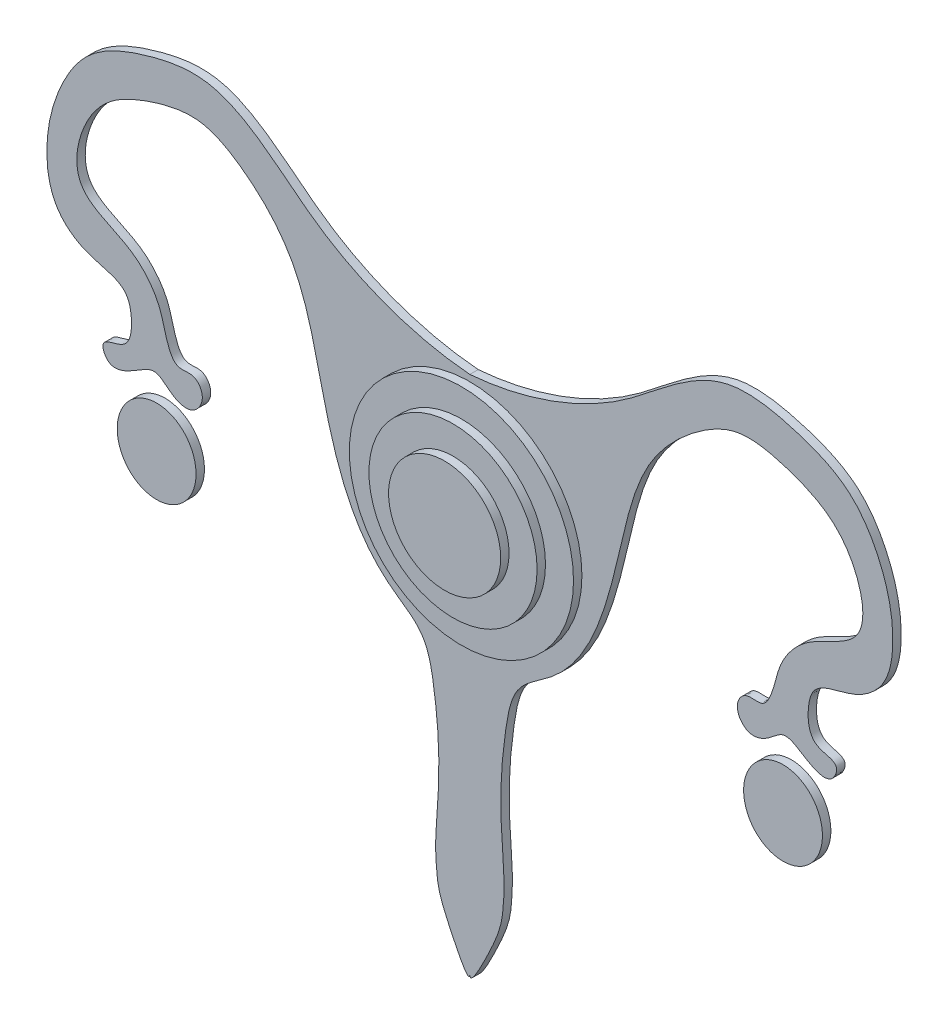
ISO-10303-21;
HEADER;
FILE_DESCRIPTION(('STEP AP214'),'2;1');
FILE_NAME('part.step','',(''),(''),'','','');
FILE_SCHEMA(('AUTOMOTIVE_DESIGN { 1 0 10303 214 1 1 1 1 }'));
ENDSEC;
DATA;
#1=APPLICATION_CONTEXT('core data for automotive mechanical design processes');
#2=APPLICATION_PROTOCOL_DEFINITION('international standard','automotive_design',2000,#1);
#3=PRODUCT_CONTEXT('',#1,'mechanical');
#4=PRODUCT('Part','Part','',(#3));
#5=PRODUCT_RELATED_PRODUCT_CATEGORY('part','',(#4));
#6=PRODUCT_DEFINITION_FORMATION('','',#4);
#7=PRODUCT_DEFINITION_CONTEXT('part definition',#1,'design');
#8=PRODUCT_DEFINITION('design','',#6,#7);
#9=PRODUCT_DEFINITION_SHAPE('','',#8);
#10=(LENGTH_UNIT() NAMED_UNIT(*) SI_UNIT(.MILLI.,.METRE.));
#11=(NAMED_UNIT(*) PLANE_ANGLE_UNIT() SI_UNIT($,.RADIAN.));
#12=(NAMED_UNIT(*) SI_UNIT($,.STERADIAN.) SOLID_ANGLE_UNIT());
#13=UNCERTAINTY_MEASURE_WITH_UNIT(LENGTH_MEASURE(1.E-05),#10,'distance_accuracy_value','');
#14=(GEOMETRIC_REPRESENTATION_CONTEXT(3) GLOBAL_UNCERTAINTY_ASSIGNED_CONTEXT((#13)) GLOBAL_UNIT_ASSIGNED_CONTEXT((#10,
#11,#12)) REPRESENTATION_CONTEXT('',''));
#15=CARTESIAN_POINT('',(0.,0.,0.));
#16=DIRECTION('',(0.,0.,1.));
#17=DIRECTION('',(1.,0.,0.));
#18=AXIS2_PLACEMENT_3D('',#15,#16,#17);
#19=CARTESIAN_POINT('',(-111.75047755853,14.551626748343,-3.));
#20=DIRECTION('',(0.,0.,1.));
#21=DIRECTION('',(0.,1.,0.));
#22=AXIS2_PLACEMENT_3D('',#19,#20,#21);
#23=ELLIPSE('',#22,14.937867758178,14.0602761459405);
#24=DIRECTION('',(0.,0.,1.));
#25=VECTOR('',#24,1.);
#26=SURFACE_OF_LINEAR_EXTRUSION('',#23,#25);
#27=CARTESIAN_POINT('',(-111.75047755853,29.489494506521,-3.));
#28=VERTEX_POINT('',#27);
#29=EDGE_CURVE('E11',#28,#28,#23,.T.);
#30=ORIENTED_EDGE('',*,*,#29,.T.);
#31=EDGE_LOOP('',(#30));
#32=FACE_BOUND('',#31,.T.);
#33=CARTESIAN_POINT('',(-111.75047755853,14.551626748343,0.));
#34=DIRECTION('',(0.,0.,1.));
#35=DIRECTION('',(0.,1.,0.));
#36=AXIS2_PLACEMENT_3D('',#33,#34,#35);
#37=ELLIPSE('',#36,14.937867758178,14.0602761459405);
#38=CARTESIAN_POINT('',(-111.75047755853,29.489494506521,0.));
#39=VERTEX_POINT('',#38);
#40=EDGE_CURVE('E43',#39,#39,#37,.T.);
#41=ORIENTED_EDGE('',*,*,#40,.F.);
#42=EDGE_LOOP('',(#41));
#43=FACE_BOUND('',#42,.T.);
#44=ADVANCED_FACE('F39',(#32,#43),#26,.T.);
#45=CARTESIAN_POINT('',(-111.75047755853,14.551626748343,-3.));
#46=DIRECTION('',(0.,0.,-1.));
#47=DIRECTION('',(-1.,0.,0.));
#48=AXIS2_PLACEMENT_3D('',#45,#46,#47);
#49=PLANE('',#48);
#50=ORIENTED_EDGE('',*,*,#29,.F.);
#51=EDGE_LOOP('',(#50));
#52=FACE_BOUND('',#51,.T.);
#53=ADVANCED_FACE('F55',(#52),#49,.T.);
#54=CARTESIAN_POINT('',(-111.75047755853,14.551626748343,0.));
#55=DIRECTION('',(0.,0.,-1.));
#56=DIRECTION('',(-1.,0.,0.));
#57=AXIS2_PLACEMENT_3D('',#54,#55,#56);
#58=PLANE('',#57);
#59=ORIENTED_EDGE('',*,*,#40,.T.);
#60=EDGE_LOOP('',(#59));
#61=FACE_BOUND('',#60,.T.);
#62=ADVANCED_FACE('F52',(#61),#58,.F.);
#63=CLOSED_SHELL('',(#44,#53,#62));
#64=MANIFOLD_SOLID_BREP('B2',#63);
#65=CARTESIAN_POINT('',(111.75047755853,14.551626748343,-3.));
#66=DIRECTION('',(0.,0.,1.));
#67=DIRECTION('',(0.,1.,0.));
#68=AXIS2_PLACEMENT_3D('',#65,#66,#67);
#69=ELLIPSE('',#68,14.937867758178,14.0602761459405);
#70=DIRECTION('',(0.,0.,1.));
#71=VECTOR('',#70,1.);
#72=SURFACE_OF_LINEAR_EXTRUSION('',#69,#71);
#73=CARTESIAN_POINT('',(111.75047755853,29.4894945065209,-3.));
#74=VERTEX_POINT('',#73);
#75=EDGE_CURVE('E38',#74,#74,#69,.T.);
#76=ORIENTED_EDGE('',*,*,#75,.T.);
#77=EDGE_LOOP('',(#76));
#78=FACE_BOUND('',#77,.T.);
#79=CARTESIAN_POINT('',(111.75047755853,14.551626748343,0.));
#80=DIRECTION('',(0.,0.,1.));
#81=DIRECTION('',(0.,1.,0.));
#82=AXIS2_PLACEMENT_3D('',#79,#80,#81);
#83=ELLIPSE('',#82,14.937867758178,14.0602761459405);
#84=CARTESIAN_POINT('',(111.75047755853,29.4894945065209,0.));
#85=VERTEX_POINT('',#84);
#86=EDGE_CURVE('E93',#85,#85,#83,.T.);
#87=ORIENTED_EDGE('',*,*,#86,.F.);
#88=EDGE_LOOP('',(#87));
#89=FACE_BOUND('',#88,.T.);
#90=ADVANCED_FACE('F89',(#78,#89),#72,.T.);
#91=CARTESIAN_POINT('',(111.75047755853,14.551626748343,-3.));
#92=DIRECTION('',(0.,0.,1.));
#93=DIRECTION('',(1.,0.,0.));
#94=AXIS2_PLACEMENT_3D('',#91,#92,#93);
#95=PLANE('',#94);
#96=ORIENTED_EDGE('',*,*,#75,.F.);
#97=EDGE_LOOP('',(#96));
#98=FACE_BOUND('',#97,.T.);
#99=ADVANCED_FACE('F105',(#98),#95,.F.);
#100=CARTESIAN_POINT('',(111.75047755853,14.551626748343,0.));
#101=DIRECTION('',(0.,0.,1.));
#102=DIRECTION('',(1.,0.,0.));
#103=AXIS2_PLACEMENT_3D('',#100,#101,#102);
#104=PLANE('',#103);
#105=ORIENTED_EDGE('',*,*,#86,.T.);
#106=EDGE_LOOP('',(#105));
#107=FACE_BOUND('',#106,.T.);
#108=ADVANCED_FACE('F102',(#107),#104,.T.);
#109=CLOSED_SHELL('',(#90,#99,#108));
#110=MANIFOLD_SOLID_BREP('B6',#109);
#111=CARTESIAN_POINT('',(0.,94.1860264979931,-3.));
#112=CARTESIAN_POINT('',(-19.6537302177839,95.7873225352322,-3.));
#113=CARTESIAN_POINT('',(-47.1668119574826,105.643613043794,-3.));
#114=CARTESIAN_POINT('',(-72.7279645060766,128.305131187115,-3.));
#115=CARTESIAN_POINT('',(-92.9058866334114,140.021406335054,-3.));
#116=CARTESIAN_POINT('',(-115.686748374215,135.784191525025,-3.));
#117=CARTESIAN_POINT('',(-136.263738846334,127.489233780023,-3.));
#118=CARTESIAN_POINT('',(-147.692311400873,108.736646772873,-3.));
#119=CARTESIAN_POINT('',(-152.076993131547,90.5103945754435,-3.));
#120=CARTESIAN_POINT('',(-149.502485802661,71.9443239218869,-3.));
#121=CARTESIAN_POINT('',(-136.984174236605,62.1727494107198,-3.));
#122=CARTESIAN_POINT('',(-122.473472886134,61.1173067435487,-3.));
#123=CARTESIAN_POINT('',(-120.227857269693,50.2710028784847,-3.));
#124=CARTESIAN_POINT('',(-121.156037187227,42.7622170130821,-3.));
#125=CARTESIAN_POINT('',(-126.364189339504,40.2620324071994,-3.));
#126=CARTESIAN_POINT('',(-132.219363326724,39.5369833457732,-3.));
#127=CARTESIAN_POINT('',(-129.045986686431,31.5888309435567,-3.));
#128=CARTESIAN_POINT('',(-120.117486709318,34.3393873344989,-3.));
#129=CARTESIAN_POINT('',(-112.714237475768,41.2014044377139,-3.));
#130=CARTESIAN_POINT('',(-106.546407413966,34.3748591697352,-3.));
#131=CARTESIAN_POINT('',(-98.921663981922,31.7045512711705,-3.));
#132=CARTESIAN_POINT('',(-93.8888638621734,39.0951294961971,-3.));
#133=CARTESIAN_POINT('',(-98.1549255828211,45.5686783007465,-3.));
#134=CARTESIAN_POINT('',(-104.948612919435,43.229305288513,-3.));
#135=CARTESIAN_POINT('',(-108.732298494561,51.3672524946958,-3.));
#136=CARTESIAN_POINT('',(-110.220119067456,61.0401888172931,-3.));
#137=CARTESIAN_POINT('',(-118.532080925812,71.5527794295733,-3.));
#138=CARTESIAN_POINT('',(-129.445203389539,76.090281087428,-3.));
#139=CARTESIAN_POINT('',(-142.555909961789,83.7449068685652,-3.));
#140=CARTESIAN_POINT('',(-139.072249612976,102.665070512151,-3.));
#141=CARTESIAN_POINT('',(-128.373726567772,115.833898422228,-3.));
#142=CARTESIAN_POINT('',(-113.07746384007,122.242680131978,-3.));
#143=CARTESIAN_POINT('',(-96.3518076576739,126.289201863572,-3.));
#144=CARTESIAN_POINT('',(-78.4444654838469,116.262111889434,-3.));
#145=CARTESIAN_POINT('',(-60.2596296074329,97.5591601151746,-3.));
#146=CARTESIAN_POINT('',(-52.0819888245694,58.7784954941941,-3.));
#147=CARTESIAN_POINT('',(-42.0468574189725,21.4241445528292,-3.));
#148=CARTESIAN_POINT('',(-15.4650308378484,6.70829293130238,-3.));
#149=CARTESIAN_POINT('',(-12.3936167400507,-10.4515879692364,-3.));
#150=CARTESIAN_POINT('',(-10.6794509092357,-27.4070591209205,-3.));
#151=CARTESIAN_POINT('',(-11.3436426568219,-44.0627862907364,-3.));
#152=CARTESIAN_POINT('',(-12.4098216257851,-55.7526459188546,-3.));
#153=CARTESIAN_POINT('',(-11.7573686234905,-68.7934715470873,-3.));
#154=CARTESIAN_POINT('',(-10.2564956404182,-74.822773294601,-3.));
#155=CARTESIAN_POINT('',(0.00161968535007339,-94.7938182462855,-3.));
#156=CARTESIAN_POINT('',(0.,-91.1013232922357,-3.));
#157=B_SPLINE_CURVE_WITH_KNOTS('',3,(#111,#112,#113,#114,#115,#116,#117,#118,#119,#120,#121,
#122,#123,#124,#125,#126,#127,#128,#129,#130,#131,#132,#133,#134,#135,#136,#137,#138,#139,#140,
#141,#142,#143,#144,#145,#146,#147,#148,#149,#150,#151,#152,#153,#154,#155,#156),.UNSPECIFIED.,
.F.,.F.,(4,1,1,1,1,1,1,1,1,1,1,1,1,1,1,1,1,1,1,1,1,1,1,1,1,1,1,1,1,1,1,1,1,1,1,1,1,1,1,1,1,1,1,
4),(0.,0.0870705785109008,0.121466148530808,0.151136945629657,0.184672951656718,
0.218739004713483,0.245122308320255,0.277020160950665,0.300839882755271,0.321760373445677,
0.343171123014181,0.354060860497419,0.366930919442553,0.371452626004022,0.379444786617247,
0.386302506128238,0.397453757502591,0.413098906426781,0.422542499999009,0.433061776173705,
0.443805783115075,0.451900988052855,0.459841600578006,0.469074451969323,0.484280341921729,
0.505549975659188,0.522539097198898,0.537148019552777,0.567113707028659,0.589197663505909,
0.611437698989549,0.638727842542172,0.660448777995701,0.697727948981881,0.749749164109175,
0.832703057432874,0.852973486614671,0.875034028890183,0.903781421212292,0.929509973183945,
0.947165145195074,0.956295421673634,0.983817212002224,1.),.UNSPECIFIED.);
#158=DIRECTION('',(0.,0.,1.));
#159=VECTOR('',#158,1.);
#160=SURFACE_OF_LINEAR_EXTRUSION('',#157,#159);
#161=CARTESIAN_POINT('',(0.,94.1860264979931,0.));
#162=CARTESIAN_POINT('',(-19.6537302177839,95.7873225352322,0.));
#163=CARTESIAN_POINT('',(-47.1668119574826,105.643613043794,0.));
#164=CARTESIAN_POINT('',(-72.7279645060766,128.305131187115,0.));
#165=CARTESIAN_POINT('',(-92.9058866334114,140.021406335054,0.));
#166=CARTESIAN_POINT('',(-115.686748374215,135.784191525025,0.));
#167=CARTESIAN_POINT('',(-136.263738846334,127.489233780023,0.));
#168=CARTESIAN_POINT('',(-147.692311400873,108.736646772873,0.));
#169=CARTESIAN_POINT('',(-152.076993131547,90.5103945754435,0.));
#170=CARTESIAN_POINT('',(-149.502485802661,71.9443239218869,0.));
#171=CARTESIAN_POINT('',(-136.984174236605,62.1727494107198,0.));
#172=CARTESIAN_POINT('',(-122.473472886134,61.1173067435487,0.));
#173=CARTESIAN_POINT('',(-120.227857269693,50.2710028784847,0.));
#174=CARTESIAN_POINT('',(-121.156037187227,42.7622170130821,0.));
#175=CARTESIAN_POINT('',(-126.364189339504,40.2620324071994,0.));
#176=CARTESIAN_POINT('',(-132.219363326724,39.5369833457732,0.));
#177=CARTESIAN_POINT('',(-129.045986686431,31.5888309435567,0.));
#178=CARTESIAN_POINT('',(-120.117486709318,34.3393873344989,0.));
#179=CARTESIAN_POINT('',(-112.714237475768,41.2014044377139,0.));
#180=CARTESIAN_POINT('',(-106.546407413966,34.3748591697352,0.));
#181=CARTESIAN_POINT('',(-98.921663981922,31.7045512711705,0.));
#182=CARTESIAN_POINT('',(-93.8888638621734,39.0951294961971,0.));
#183=CARTESIAN_POINT('',(-98.1549255828211,45.5686783007465,0.));
#184=CARTESIAN_POINT('',(-104.948612919435,43.229305288513,0.));
#185=CARTESIAN_POINT('',(-108.732298494561,51.3672524946958,0.));
#186=CARTESIAN_POINT('',(-110.220119067456,61.0401888172931,0.));
#187=CARTESIAN_POINT('',(-118.532080925812,71.5527794295733,0.));
#188=CARTESIAN_POINT('',(-129.445203389539,76.090281087428,0.));
#189=CARTESIAN_POINT('',(-142.555909961789,83.7449068685652,0.));
#190=CARTESIAN_POINT('',(-139.072249612976,102.665070512151,0.));
#191=CARTESIAN_POINT('',(-128.373726567772,115.833898422228,0.));
#192=CARTESIAN_POINT('',(-113.07746384007,122.242680131978,0.));
#193=CARTESIAN_POINT('',(-96.3518076576739,126.289201863572,0.));
#194=CARTESIAN_POINT('',(-78.4444654838469,116.262111889434,0.));
#195=CARTESIAN_POINT('',(-60.2596296074329,97.5591601151746,0.));
#196=CARTESIAN_POINT('',(-52.0819888245694,58.7784954941941,0.));
#197=CARTESIAN_POINT('',(-42.0468574189725,21.4241445528292,0.));
#198=CARTESIAN_POINT('',(-15.4650308378484,6.70829293130238,0.));
#199=CARTESIAN_POINT('',(-12.3936167400507,-10.4515879692364,0.));
#200=CARTESIAN_POINT('',(-10.6794509092357,-27.4070591209205,0.));
#201=CARTESIAN_POINT('',(-11.3436426568219,-44.0627862907364,0.));
#202=CARTESIAN_POINT('',(-12.4098216257851,-55.7526459188546,0.));
#203=CARTESIAN_POINT('',(-11.7573686234905,-68.7934715470873,0.));
#204=CARTESIAN_POINT('',(-10.2564956404182,-74.822773294601,0.));
#205=CARTESIAN_POINT('',(0.00161968535007339,-94.7938182462855,0.));
#206=CARTESIAN_POINT('',(0.,-91.1013232922357,0.));
#207=B_SPLINE_CURVE_WITH_KNOTS('',3,(#161,#162,#163,#164,#165,#166,#167,#168,#169,#170,#171,
#172,#173,#174,#175,#176,#177,#178,#179,#180,#181,#182,#183,#184,#185,#186,#187,#188,#189,#190,
#191,#192,#193,#194,#195,#196,#197,#198,#199,#200,#201,#202,#203,#204,#205,#206),.UNSPECIFIED.,
.F.,.F.,(4,1,1,1,1,1,1,1,1,1,1,1,1,1,1,1,1,1,1,1,1,1,1,1,1,1,1,1,1,1,1,1,1,1,1,1,1,1,1,1,1,1,1,
4),(0.,0.0870705785109008,0.121466148530808,0.151136945629657,0.184672951656718,
0.218739004713483,0.245122308320255,0.277020160950665,0.300839882755271,0.321760373445677,
0.343171123014181,0.354060860497419,0.366930919442553,0.371452626004022,0.379444786617247,
0.386302506128238,0.397453757502591,0.413098906426781,0.422542499999009,0.433061776173705,
0.443805783115075,0.451900988052855,0.459841600578006,0.469074451969323,0.484280341921729,
0.505549975659188,0.522539097198898,0.537148019552777,0.567113707028659,0.589197663505909,
0.611437698989549,0.638727842542172,0.660448777995701,0.697727948981881,0.749749164109175,
0.832703057432874,0.852973486614671,0.875034028890183,0.903781421212292,0.929509973183945,
0.947165145195074,0.956295421673634,0.983817212002224,1.),.UNSPECIFIED.);
#208=CARTESIAN_POINT('',(0.,94.1860264979931,0.));
#209=VERTEX_POINT('',#208);
#210=CARTESIAN_POINT('',(0.,-91.1013232922357,0.));
#211=VERTEX_POINT('',#210);
#212=EDGE_CURVE('E164',#209,#211,#207,.T.);
#213=ORIENTED_EDGE('',*,*,#212,.F.);
#214=DIRECTION('',(0.,0.,1.));
#215=VECTOR('',#214,1.);
#216=CARTESIAN_POINT('',(0.,94.1860264979931,-3.));
#217=LINE('',#216,#215);
#218=CARTESIAN_POINT('',(0.,94.1860264979931,-3.));
#219=VERTEX_POINT('',#218);
#220=EDGE_CURVE('E149',#219,#209,#217,.T.);
#221=ORIENTED_EDGE('',*,*,#220,.F.);
#222=CARTESIAN_POINT('',(0.,-91.1013232922357,-3.));
#223=VERTEX_POINT('',#222);
#224=EDGE_CURVE('E169',#219,#223,#157,.T.);
#225=ORIENTED_EDGE('',*,*,#224,.T.);
#226=DIRECTION('',(0.,0.,1.));
#227=VECTOR('',#226,1.);
#228=CARTESIAN_POINT('',(0.,-91.1013232922357,-3.));
#229=LINE('',#228,#227);
#230=EDGE_CURVE('E134',#223,#211,#229,.T.);
#231=ORIENTED_EDGE('',*,*,#230,.T.);
#232=EDGE_LOOP('',(#213,#221,#225,#231));
#233=FACE_BOUND('',#232,.T.);
#234=ADVANCED_FACE('F130',(#233),#160,.T.);
#235=CARTESIAN_POINT('',(0.,-91.1013232922357,-3.));
#236=CARTESIAN_POINT('',(-0.0016196853500271,-94.7938182462864,-3.));
#237=CARTESIAN_POINT('',(10.2564956404183,-74.8227732946002,-3.));
#238=CARTESIAN_POINT('',(11.7573686234905,-68.7934715470874,-3.));
#239=CARTESIAN_POINT('',(12.4098216257852,-55.7526459188545,-3.));
#240=CARTESIAN_POINT('',(11.343642656822,-44.0627862907364,-3.));
#241=CARTESIAN_POINT('',(10.6794509092358,-27.4070591209204,-3.));
#242=CARTESIAN_POINT('',(12.3936167400507,-10.4515879692364,-3.));
#243=CARTESIAN_POINT('',(15.4650308378484,6.70829293130238,-3.));
#244=CARTESIAN_POINT('',(42.0468574189725,21.4241445528293,-3.));
#245=CARTESIAN_POINT('',(52.0819888245695,58.7784954941942,-3.));
#246=CARTESIAN_POINT('',(60.2596296074329,97.5591601151745,-3.));
#247=CARTESIAN_POINT('',(78.4444654838469,116.262111889434,-3.));
#248=CARTESIAN_POINT('',(96.3518076576739,126.289201863572,-3.));
#249=CARTESIAN_POINT('',(113.07746384007,122.242680131978,-3.));
#250=CARTESIAN_POINT('',(128.373726567772,115.833898422228,-3.));
#251=CARTESIAN_POINT('',(139.072249612976,102.665070512151,-3.));
#252=CARTESIAN_POINT('',(142.555909961789,83.7449068685652,-3.));
#253=CARTESIAN_POINT('',(129.445203389539,76.0902810874281,-3.));
#254=CARTESIAN_POINT('',(118.532080925812,71.5527794295733,-3.));
#255=CARTESIAN_POINT('',(110.220119067456,61.0401888172931,-3.));
#256=CARTESIAN_POINT('',(108.732298494561,51.3672524946958,-3.));
#257=CARTESIAN_POINT('',(104.948612919435,43.229305288513,-3.));
#258=CARTESIAN_POINT('',(98.1549255828212,45.5686783007465,-3.));
#259=CARTESIAN_POINT('',(93.8888638621734,39.0951294961971,-3.));
#260=CARTESIAN_POINT('',(98.921663981922,31.7045512711706,-3.));
#261=CARTESIAN_POINT('',(106.546407413966,34.3748591697352,-3.));
#262=CARTESIAN_POINT('',(112.714237475768,41.2014044377139,-3.));
#263=CARTESIAN_POINT('',(120.117486709318,34.3393873344989,-3.));
#264=CARTESIAN_POINT('',(129.045986686431,31.5888309435568,-3.));
#265=CARTESIAN_POINT('',(132.219363326724,39.5369833457732,-3.));
#266=CARTESIAN_POINT('',(126.364189339504,40.2620324071995,-3.));
#267=CARTESIAN_POINT('',(121.156037187227,42.7622170130821,-3.));
#268=CARTESIAN_POINT('',(120.227857269693,50.2710028784847,-3.));
#269=CARTESIAN_POINT('',(122.473472886134,61.1173067435488,-3.));
#270=CARTESIAN_POINT('',(136.984174236605,62.1727494107198,-3.));
#271=CARTESIAN_POINT('',(149.502485802661,71.944323921887,-3.));
#272=CARTESIAN_POINT('',(152.076993131547,90.5103945754435,-3.));
#273=CARTESIAN_POINT('',(147.692311400873,108.736646772874,-3.));
#274=CARTESIAN_POINT('',(136.263738846334,127.489233780023,-3.));
#275=CARTESIAN_POINT('',(115.686748374215,135.784191525025,-3.));
#276=CARTESIAN_POINT('',(92.9058866334114,140.021406335054,-3.));
#277=CARTESIAN_POINT('',(72.7279645060766,128.305131187115,-3.));
#278=CARTESIAN_POINT('',(47.1668119574826,105.643613043794,-3.));
#279=CARTESIAN_POINT('',(19.6537302177839,95.7873225352322,-3.));
#280=CARTESIAN_POINT('',(0.,94.1860264979931,-3.));
#281=B_SPLINE_CURVE_WITH_KNOTS('',3,(#235,#236,#237,#238,#239,#240,#241,#242,#243,#244,#245,
#246,#247,#248,#249,#250,#251,#252,#253,#254,#255,#256,#257,#258,#259,#260,#261,#262,#263,#264,
#265,#266,#267,#268,#269,#270,#271,#272,#273,#274,#275,#276,#277,#278,#279,#280),.UNSPECIFIED.,
.F.,.F.,(4,1,1,1,1,1,1,1,1,1,1,1,1,1,1,1,1,1,1,1,1,1,1,1,1,1,1,1,1,1,1,1,1,1,1,1,1,1,1,1,1,1,1,
4),(0.,0.0161827879977757,0.0437045783263661,0.0528348548049259,0.0704900268160553,
0.0962185787877082,0.124965971109817,0.147026513385329,0.167296942567126,0.250250835890825,
0.30227205101812,0.339551222004299,0.361272157457828,0.388562301010451,0.410802336494091,
0.432886292971341,0.462851980447223,0.477460902801102,0.494450024340812,0.515719658078271,
0.530925548030677,0.540158399421994,0.548099011947145,0.556194216884925,0.566938223826296,
0.577457500000991,0.586901093573219,0.602546242497409,0.613697493871762,0.620555213382753,
0.628547373995978,0.633069080557447,0.645939139502581,0.656828876985819,0.678239626554323,
0.699160117244729,0.722979839049335,0.754877691679745,0.781260995286517,0.815327048343282,
0.848863054370343,0.878533851469192,0.912929421489099,1.),.UNSPECIFIED.);
#282=DIRECTION('',(0.,0.,1.));
#283=VECTOR('',#282,1.);
#284=SURFACE_OF_LINEAR_EXTRUSION('',#281,#283);
#285=CARTESIAN_POINT('',(0.,-91.1013232922357,0.));
#286=CARTESIAN_POINT('',(-0.0016196853500271,-94.7938182462864,0.));
#287=CARTESIAN_POINT('',(10.2564956404183,-74.8227732946002,0.));
#288=CARTESIAN_POINT('',(11.7573686234905,-68.7934715470874,0.));
#289=CARTESIAN_POINT('',(12.4098216257852,-55.7526459188545,0.));
#290=CARTESIAN_POINT('',(11.343642656822,-44.0627862907364,0.));
#291=CARTESIAN_POINT('',(10.6794509092358,-27.4070591209204,0.));
#292=CARTESIAN_POINT('',(12.3936167400507,-10.4515879692364,0.));
#293=CARTESIAN_POINT('',(15.4650308378484,6.70829293130238,0.));
#294=CARTESIAN_POINT('',(42.0468574189725,21.4241445528293,0.));
#295=CARTESIAN_POINT('',(52.0819888245695,58.7784954941942,0.));
#296=CARTESIAN_POINT('',(60.2596296074329,97.5591601151745,0.));
#297=CARTESIAN_POINT('',(78.4444654838469,116.262111889434,0.));
#298=CARTESIAN_POINT('',(96.3518076576739,126.289201863572,0.));
#299=CARTESIAN_POINT('',(113.07746384007,122.242680131978,0.));
#300=CARTESIAN_POINT('',(128.373726567772,115.833898422228,0.));
#301=CARTESIAN_POINT('',(139.072249612976,102.665070512151,0.));
#302=CARTESIAN_POINT('',(142.555909961789,83.7449068685652,0.));
#303=CARTESIAN_POINT('',(129.445203389539,76.0902810874281,0.));
#304=CARTESIAN_POINT('',(118.532080925812,71.5527794295733,0.));
#305=CARTESIAN_POINT('',(110.220119067456,61.0401888172931,0.));
#306=CARTESIAN_POINT('',(108.732298494561,51.3672524946958,0.));
#307=CARTESIAN_POINT('',(104.948612919435,43.229305288513,0.));
#308=CARTESIAN_POINT('',(98.1549255828212,45.5686783007465,0.));
#309=CARTESIAN_POINT('',(93.8888638621734,39.0951294961971,0.));
#310=CARTESIAN_POINT('',(98.921663981922,31.7045512711706,0.));
#311=CARTESIAN_POINT('',(106.546407413966,34.3748591697352,0.));
#312=CARTESIAN_POINT('',(112.714237475768,41.2014044377139,0.));
#313=CARTESIAN_POINT('',(120.117486709318,34.3393873344989,0.));
#314=CARTESIAN_POINT('',(129.045986686431,31.5888309435568,0.));
#315=CARTESIAN_POINT('',(132.219363326724,39.5369833457732,0.));
#316=CARTESIAN_POINT('',(126.364189339504,40.2620324071995,0.));
#317=CARTESIAN_POINT('',(121.156037187227,42.7622170130821,0.));
#318=CARTESIAN_POINT('',(120.227857269693,50.2710028784847,0.));
#319=CARTESIAN_POINT('',(122.473472886134,61.1173067435488,0.));
#320=CARTESIAN_POINT('',(136.984174236605,62.1727494107198,0.));
#321=CARTESIAN_POINT('',(149.502485802661,71.944323921887,0.));
#322=CARTESIAN_POINT('',(152.076993131547,90.5103945754435,0.));
#323=CARTESIAN_POINT('',(147.692311400873,108.736646772874,0.));
#324=CARTESIAN_POINT('',(136.263738846334,127.489233780023,0.));
#325=CARTESIAN_POINT('',(115.686748374215,135.784191525025,0.));
#326=CARTESIAN_POINT('',(92.9058866334114,140.021406335054,0.));
#327=CARTESIAN_POINT('',(72.7279645060766,128.305131187115,0.));
#328=CARTESIAN_POINT('',(47.1668119574826,105.643613043794,0.));
#329=CARTESIAN_POINT('',(19.6537302177839,95.7873225352322,0.));
#330=CARTESIAN_POINT('',(0.,94.1860264979931,0.));
#331=B_SPLINE_CURVE_WITH_KNOTS('',3,(#285,#286,#287,#288,#289,#290,#291,#292,#293,#294,#295,
#296,#297,#298,#299,#300,#301,#302,#303,#304,#305,#306,#307,#308,#309,#310,#311,#312,#313,#314,
#315,#316,#317,#318,#319,#320,#321,#322,#323,#324,#325,#326,#327,#328,#329,#330),.UNSPECIFIED.,
.F.,.F.,(4,1,1,1,1,1,1,1,1,1,1,1,1,1,1,1,1,1,1,1,1,1,1,1,1,1,1,1,1,1,1,1,1,1,1,1,1,1,1,1,1,1,1,
4),(0.,0.0161827879977757,0.0437045783263661,0.0528348548049259,0.0704900268160553,
0.0962185787877082,0.124965971109817,0.147026513385329,0.167296942567126,0.250250835890825,
0.30227205101812,0.339551222004299,0.361272157457828,0.388562301010451,0.410802336494091,
0.432886292971341,0.462851980447223,0.477460902801102,0.494450024340812,0.515719658078271,
0.530925548030677,0.540158399421994,0.548099011947145,0.556194216884925,0.566938223826296,
0.577457500000991,0.586901093573219,0.602546242497409,0.613697493871762,0.620555213382753,
0.628547373995978,0.633069080557447,0.645939139502581,0.656828876985819,0.678239626554323,
0.699160117244729,0.722979839049335,0.754877691679745,0.781260995286517,0.815327048343282,
0.848863054370343,0.878533851469192,0.912929421489099,1.),.UNSPECIFIED.);
#332=EDGE_CURVE('E161',#211,#209,#331,.T.);
#333=ORIENTED_EDGE('',*,*,#332,.F.);
#334=ORIENTED_EDGE('',*,*,#230,.F.);
#335=EDGE_CURVE('E163',#223,#219,#281,.T.);
#336=ORIENTED_EDGE('',*,*,#335,.T.);
#337=ORIENTED_EDGE('',*,*,#220,.T.);
#338=EDGE_LOOP('',(#333,#334,#336,#337));
#339=FACE_BOUND('',#338,.T.);
#340=ADVANCED_FACE('F159',(#339),#284,.T.);
#341=CARTESIAN_POINT('',(-116.879378929391,68.5884117190682,-3.));
#342=DIRECTION('',(0.,0.,1.));
#343=DIRECTION('',(1.,0.,0.));
#344=AXIS2_PLACEMENT_3D('',#341,#342,#343);
#345=PLANE('',#344);
#346=ORIENTED_EDGE('',*,*,#224,.F.);
#347=ORIENTED_EDGE('',*,*,#335,.F.);
#348=EDGE_LOOP('',(#346,#347));
#349=FACE_BOUND('',#348,.T.);
#350=ADVANCED_FACE('F194',(#349),#345,.F.);
#351=CARTESIAN_POINT('',(-116.879378929391,68.5884117190682,0.));
#352=DIRECTION('',(0.,0.,1.));
#353=DIRECTION('',(1.,0.,0.));
#354=AXIS2_PLACEMENT_3D('',#351,#352,#353);
#355=PLANE('',#354);
#356=CARTESIAN_POINT('',(0.,51.9570247214848,0.));
#357=DIRECTION('',(0.,0.,1.));
#358=DIRECTION('',(1.,0.,0.));
#359=AXIS2_PLACEMENT_3D('',#356,#357,#358);
#360=CIRCLE('',#359,40.);
#361=CARTESIAN_POINT('',(40.,51.9570247214848,0.));
#362=VERTEX_POINT('',#361);
#363=EDGE_CURVE('E291',#362,#362,#360,.T.);
#364=ORIENTED_EDGE('',*,*,#363,.F.);
#365=EDGE_LOOP('',(#364));
#366=FACE_BOUND('',#365,.T.);
#367=ORIENTED_EDGE('',*,*,#212,.T.);
#368=ORIENTED_EDGE('',*,*,#332,.T.);
#369=EDGE_LOOP('',(#367,#368));
#370=FACE_BOUND('',#369,.T.);
#371=ADVANCED_FACE('F168',(#366,#370),#355,.T.);
#372=CARTESIAN_POINT('',(0.,51.9570247214848,3.));
#373=DIRECTION('',(0.,0.,-1.));
#374=DIRECTION('',(-1.,0.,0.));
#375=AXIS2_PLACEMENT_3D('',#372,#373,#374);
#376=CYLINDRICAL_SURFACE('',#375,40.);
#377=CARTESIAN_POINT('',(0.,51.9570247214848,3.));
#378=DIRECTION('',(0.,0.,1.));
#379=DIRECTION('',(1.,0.,0.));
#380=AXIS2_PLACEMENT_3D('',#377,#378,#379);
#381=CIRCLE('',#380,40.);
#382=CARTESIAN_POINT('',(40.,51.9570247214848,3.));
#383=VERTEX_POINT('',#382);
#384=EDGE_CURVE('E166',#383,#383,#381,.T.);
#385=ORIENTED_EDGE('',*,*,#384,.F.);
#386=EDGE_LOOP('',(#385));
#387=FACE_BOUND('',#386,.T.);
#388=ORIENTED_EDGE('',*,*,#363,.T.);
#389=EDGE_LOOP('',(#388));
#390=FACE_BOUND('',#389,.T.);
#391=ADVANCED_FACE('F197',(#387,#390),#376,.T.);
#392=CARTESIAN_POINT('',(0.,51.9570247214848,3.));
#393=DIRECTION('',(0.,0.,1.));
#394=DIRECTION('',(1.,0.,0.));
#395=AXIS2_PLACEMENT_3D('',#392,#393,#394);
#396=PLANE('',#395);
#397=CARTESIAN_POINT('',(0.,51.9570247214848,3.));
#398=DIRECTION('',(0.,0.,1.));
#399=DIRECTION('',(1.,0.,0.));
#400=AXIS2_PLACEMENT_3D('',#397,#398,#399);
#401=CIRCLE('',#400,30.);
#402=CARTESIAN_POINT('',(30.,51.9570247214848,3.));
#403=VERTEX_POINT('',#402);
#404=EDGE_CURVE('E140',#403,#403,#401,.T.);
#405=ORIENTED_EDGE('',*,*,#404,.F.);
#406=EDGE_LOOP('',(#405));
#407=FACE_BOUND('',#406,.T.);
#408=ORIENTED_EDGE('',*,*,#384,.T.);
#409=EDGE_LOOP('',(#408));
#410=FACE_BOUND('',#409,.T.);
#411=ADVANCED_FACE('F204',(#407,#410),#396,.T.);
#412=CARTESIAN_POINT('',(0.,51.9570247214848,6.));
#413=DIRECTION('',(0.,0.,-1.));
#414=DIRECTION('',(-1.,0.,0.));
#415=AXIS2_PLACEMENT_3D('',#412,#413,#414);
#416=CYLINDRICAL_SURFACE('',#415,30.);
#417=CARTESIAN_POINT('',(0.,51.9570247214848,6.));
#418=DIRECTION('',(0.,0.,1.));
#419=DIRECTION('',(1.,0.,0.));
#420=AXIS2_PLACEMENT_3D('',#417,#418,#419);
#421=CIRCLE('',#420,30.);
#422=CARTESIAN_POINT('',(30.,51.9570247214848,6.));
#423=VERTEX_POINT('',#422);
#424=EDGE_CURVE('E288',#423,#423,#421,.T.);
#425=ORIENTED_EDGE('',*,*,#424,.F.);
#426=EDGE_LOOP('',(#425));
#427=FACE_BOUND('',#426,.T.);
#428=ORIENTED_EDGE('',*,*,#404,.T.);
#429=EDGE_LOOP('',(#428));
#430=FACE_BOUND('',#429,.T.);
#431=ADVANCED_FACE('F208',(#427,#430),#416,.T.);
#432=CARTESIAN_POINT('',(0.,51.9570247214848,6.));
#433=DIRECTION('',(0.,0.,1.));
#434=DIRECTION('',(1.,0.,0.));
#435=AXIS2_PLACEMENT_3D('',#432,#433,#434);
#436=PLANE('',#435);
#437=CARTESIAN_POINT('',(0.,51.9570247214848,6.));
#438=DIRECTION('',(0.,0.,1.));
#439=DIRECTION('',(1.,0.,0.));
#440=AXIS2_PLACEMENT_3D('',#437,#438,#439);
#441=CIRCLE('',#440,20.);
#442=CARTESIAN_POINT('',(20.,51.9570247214848,6.));
#443=VERTEX_POINT('',#442);
#444=EDGE_CURVE('E87',#443,#443,#441,.T.);
#445=ORIENTED_EDGE('',*,*,#444,.F.);
#446=EDGE_LOOP('',(#445));
#447=FACE_BOUND('',#446,.T.);
#448=ORIENTED_EDGE('',*,*,#424,.T.);
#449=EDGE_LOOP('',(#448));
#450=FACE_BOUND('',#449,.T.);
#451=ADVANCED_FACE('F212',(#447,#450),#436,.T.);
#452=CARTESIAN_POINT('',(0.,51.9570247214848,9.));
#453=DIRECTION('',(0.,0.,-1.));
#454=DIRECTION('',(-1.,0.,0.));
#455=AXIS2_PLACEMENT_3D('',#452,#453,#454);
#456=CYLINDRICAL_SURFACE('',#455,20.);
#457=CARTESIAN_POINT('',(0.,51.9570247214848,9.));
#458=DIRECTION('',(0.,0.,1.));
#459=DIRECTION('',(1.,0.,0.));
#460=AXIS2_PLACEMENT_3D('',#457,#458,#459);
#461=CIRCLE('',#460,20.);
#462=CARTESIAN_POINT('',(20.,51.9570247214848,9.));
#463=VERTEX_POINT('',#462);
#464=EDGE_CURVE('E287',#463,#463,#461,.T.);
#465=ORIENTED_EDGE('',*,*,#464,.F.);
#466=EDGE_LOOP('',(#465));
#467=FACE_BOUND('',#466,.T.);
#468=ORIENTED_EDGE('',*,*,#444,.T.);
#469=EDGE_LOOP('',(#468));
#470=FACE_BOUND('',#469,.T.);
#471=ADVANCED_FACE('F216',(#467,#470),#456,.T.);
#472=CARTESIAN_POINT('',(0.,51.9570247214848,9.));
#473=DIRECTION('',(0.,0.,1.));
#474=DIRECTION('',(1.,0.,0.));
#475=AXIS2_PLACEMENT_3D('',#472,#473,#474);
#476=PLANE('',#475);
#477=ORIENTED_EDGE('',*,*,#464,.T.);
#478=EDGE_LOOP('',(#477));
#479=FACE_BOUND('',#478,.T.);
#480=ADVANCED_FACE('F220',(#479),#476,.T.);
#481=CLOSED_SHELL('',(#234,#340,#350,#371,#391,#411,#431,#451,#471,#480));
#482=MANIFOLD_SOLID_BREP('B33',#481);
#483=ADVANCED_BREP_SHAPE_REPRESENTATION('',(#18,#64,#110,#482),#14);
#484=SHAPE_DEFINITION_REPRESENTATION(#9,#483);
ENDSEC;
END-ISO-10303-21;
